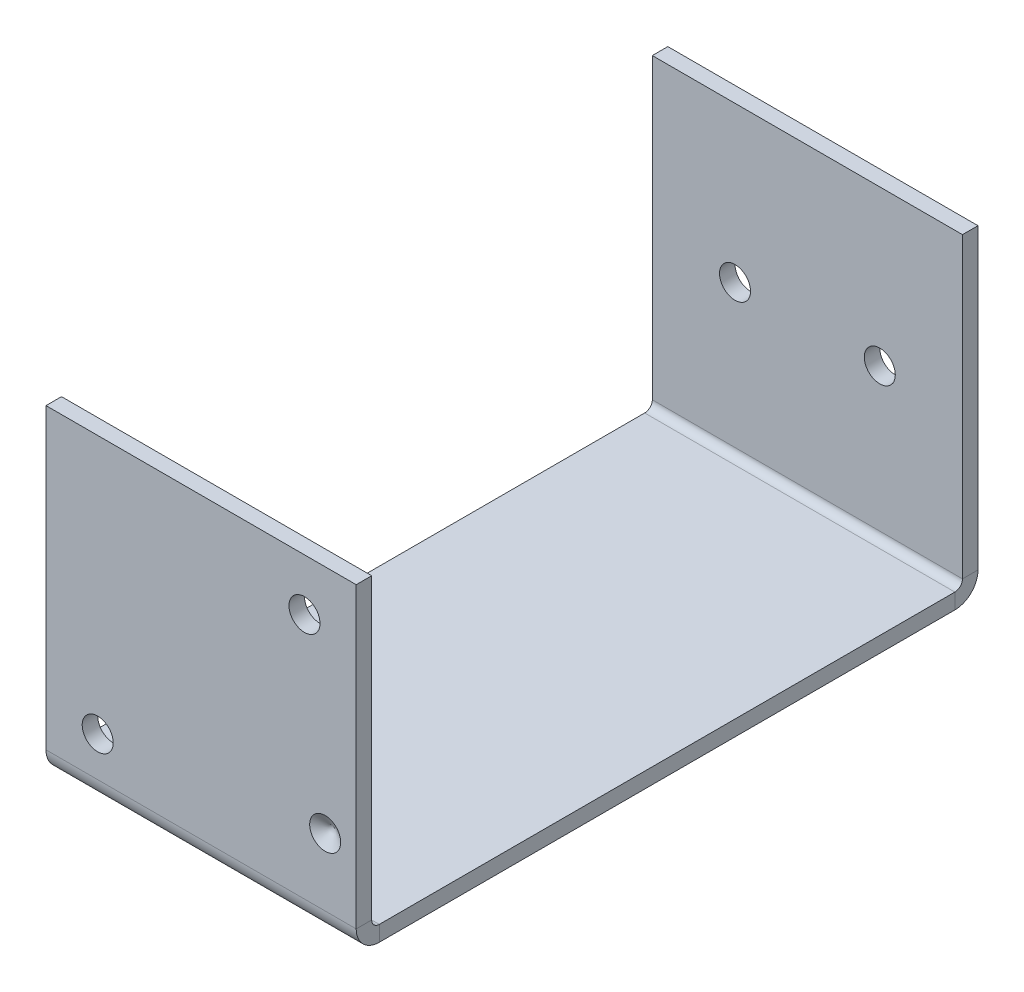
ISO-10303-21;
HEADER;
FILE_DESCRIPTION(('STEP AP214'),'2;1');
FILE_NAME('part.step','',(''),(''),'','','');
FILE_SCHEMA(('AUTOMOTIVE_DESIGN { 1 0 10303 214 1 1 1 1 }'));
ENDSEC;
DATA;
#1=APPLICATION_CONTEXT('core data for automotive mechanical design processes');
#2=APPLICATION_PROTOCOL_DEFINITION('international standard','automotive_design',2000,#1);
#3=PRODUCT_CONTEXT('',#1,'mechanical');
#4=PRODUCT('Part','Part','',(#3));
#5=PRODUCT_RELATED_PRODUCT_CATEGORY('part','',(#4));
#6=PRODUCT_DEFINITION_FORMATION('','',#4);
#7=PRODUCT_DEFINITION_CONTEXT('part definition',#1,'design');
#8=PRODUCT_DEFINITION('design','',#6,#7);
#9=PRODUCT_DEFINITION_SHAPE('','',#8);
#10=(LENGTH_UNIT() NAMED_UNIT(*) SI_UNIT(.MILLI.,.METRE.));
#11=(NAMED_UNIT(*) PLANE_ANGLE_UNIT() SI_UNIT($,.RADIAN.));
#12=(NAMED_UNIT(*) SI_UNIT($,.STERADIAN.) SOLID_ANGLE_UNIT());
#13=UNCERTAINTY_MEASURE_WITH_UNIT(LENGTH_MEASURE(1.E-05),#10,'distance_accuracy_value','');
#14=(GEOMETRIC_REPRESENTATION_CONTEXT(3) GLOBAL_UNCERTAINTY_ASSIGNED_CONTEXT((#13)) GLOBAL_UNIT_ASSIGNED_CONTEXT((#10,
#11,#12)) REPRESENTATION_CONTEXT('',''));
#15=CARTESIAN_POINT('',(0.,0.,0.));
#16=DIRECTION('',(0.,0.,1.));
#17=DIRECTION('',(1.,0.,0.));
#18=AXIS2_PLACEMENT_3D('',#15,#16,#17);
#19=CARTESIAN_POINT('',(0.,0.,0.));
#20=DIRECTION('',(0.,-1.,0.));
#21=DIRECTION('',(0.,0.,-1.));
#22=AXIS2_PLACEMENT_3D('',#19,#20,#21);
#23=PLANE('',#22);
#24=DIRECTION('',(0.,0.,1.));
#25=VECTOR('',#24,1.);
#26=CARTESIAN_POINT('',(0.,0.,0.));
#27=LINE('',#26,#25);
#28=CARTESIAN_POINT('',(0.,0.,-86.8324270902934));
#29=VERTEX_POINT('',#28);
#30=CARTESIAN_POINT('',(0.,0.,-31.1675729097066));
#31=VERTEX_POINT('',#30);
#32=EDGE_CURVE('E75',#29,#31,#27,.T.);
#33=ORIENTED_EDGE('',*,*,#32,.T.);
#34=DIRECTION('',(1.,0.,0.));
#35=VECTOR('',#34,1.);
#36=CARTESIAN_POINT('',(0.,0.,-31.1675729097066));
#37=LINE('',#36,#35);
#38=CARTESIAN_POINT('',(30.,0.,-31.1675729097066));
#39=VERTEX_POINT('',#38);
#40=EDGE_CURVE('E67',#31,#39,#37,.T.);
#41=ORIENTED_EDGE('',*,*,#40,.T.);
#42=DIRECTION('',(0.,0.,-1.));
#43=VECTOR('',#42,1.);
#44=CARTESIAN_POINT('',(30.,0.,0.));
#45=LINE('',#44,#43);
#46=CARTESIAN_POINT('',(30.,0.,-86.8324270902933));
#47=VERTEX_POINT('',#46);
#48=EDGE_CURVE('E83',#39,#47,#45,.T.);
#49=ORIENTED_EDGE('',*,*,#48,.T.);
#50=DIRECTION('',(1.,0.,0.));
#51=VECTOR('',#50,1.);
#52=CARTESIAN_POINT('',(0.,0.,-86.8324270902934));
#53=LINE('',#52,#51);
#54=EDGE_CURVE('E279',#29,#47,#53,.T.);
#55=ORIENTED_EDGE('',*,*,#54,.F.);
#56=EDGE_LOOP('',(#33,#41,#49,#55));
#57=FACE_BOUND('',#56,.T.);
#58=ADVANCED_FACE('F58',(#57),#23,.F.);
#59=CARTESIAN_POINT('',(0.,-1.5,0.));
#60=DIRECTION('',(-1.,0.,0.));
#61=DIRECTION('',(0.,0.,1.));
#62=AXIS2_PLACEMENT_3D('',#59,#60,#61);
#63=PLANE('',#62);
#64=DIRECTION('',(0.,-1.,0.));
#65=VECTOR('',#64,1.);
#66=CARTESIAN_POINT('',(0.,-1.5,-31.1675729097066));
#67=LINE('',#66,#65);
#68=CARTESIAN_POINT('',(0.,-1.5,-31.1675729097066));
#69=VERTEX_POINT('',#68);
#70=EDGE_CURVE('E14',#31,#69,#67,.T.);
#71=ORIENTED_EDGE('',*,*,#70,.F.);
#72=ORIENTED_EDGE('',*,*,#32,.F.);
#73=DIRECTION('',(0.,-1.,0.));
#74=VECTOR('',#73,1.);
#75=CARTESIAN_POINT('',(0.,-1.50000000000001,-86.8324270902934));
#76=LINE('',#75,#74);
#77=CARTESIAN_POINT('',(0.,-1.5,-86.8324270902933));
#78=VERTEX_POINT('',#77);
#79=EDGE_CURVE('E276',#29,#78,#76,.T.);
#80=ORIENTED_EDGE('',*,*,#79,.T.);
#81=DIRECTION('',(0.,0.,1.));
#82=VECTOR('',#81,1.);
#83=CARTESIAN_POINT('',(0.,-1.5,0.));
#84=LINE('',#83,#82);
#85=EDGE_CURVE('E291',#78,#69,#84,.T.);
#86=ORIENTED_EDGE('',*,*,#85,.T.);
#87=EDGE_LOOP('',(#71,#72,#80,#86));
#88=FACE_BOUND('',#87,.T.);
#89=ADVANCED_FACE('F60',(#88),#63,.T.);
#90=CARTESIAN_POINT('',(30.,-1.5,0.));
#91=DIRECTION('',(1.,0.,0.));
#92=DIRECTION('',(0.,0.,-1.));
#93=AXIS2_PLACEMENT_3D('',#90,#91,#92);
#94=PLANE('',#93);
#95=DIRECTION('',(0.,1.,0.));
#96=VECTOR('',#95,1.);
#97=CARTESIAN_POINT('',(30.,-1.5,-31.1675729097066));
#98=LINE('',#97,#96);
#99=CARTESIAN_POINT('',(30.,-1.5,-31.1675729097066));
#100=VERTEX_POINT('',#99);
#101=EDGE_CURVE('E287',#100,#39,#98,.T.);
#102=ORIENTED_EDGE('',*,*,#101,.F.);
#103=DIRECTION('',(0.,0.,-1.));
#104=VECTOR('',#103,1.);
#105=CARTESIAN_POINT('',(30.,-1.5,0.));
#106=LINE('',#105,#104);
#107=CARTESIAN_POINT('',(30.,-1.5,-86.8324270902933));
#108=VERTEX_POINT('',#107);
#109=EDGE_CURVE('E62',#100,#108,#106,.T.);
#110=ORIENTED_EDGE('',*,*,#109,.T.);
#111=DIRECTION('',(0.,1.,0.));
#112=VECTOR('',#111,1.);
#113=CARTESIAN_POINT('',(30.,-1.50000000000001,-86.8324270902934));
#114=LINE('',#113,#112);
#115=EDGE_CURVE('E282',#108,#47,#114,.T.);
#116=ORIENTED_EDGE('',*,*,#115,.T.);
#117=ORIENTED_EDGE('',*,*,#48,.F.);
#118=EDGE_LOOP('',(#102,#110,#116,#117));
#119=FACE_BOUND('',#118,.T.);
#120=ADVANCED_FACE('F295',(#119),#94,.T.);
#121=CARTESIAN_POINT('',(0.,-1.5,0.));
#122=DIRECTION('',(0.,-1.,0.));
#123=DIRECTION('',(0.,0.,-1.));
#124=AXIS2_PLACEMENT_3D('',#121,#122,#123);
#125=PLANE('',#124);
#126=DIRECTION('',(1.,0.,0.));
#127=VECTOR('',#126,1.);
#128=CARTESIAN_POINT('',(0.,-1.5,-31.1675729097066));
#129=LINE('',#128,#127);
#130=EDGE_CURVE('E284',#69,#100,#129,.T.);
#131=ORIENTED_EDGE('',*,*,#130,.F.);
#132=ORIENTED_EDGE('',*,*,#85,.F.);
#133=DIRECTION('',(1.,0.,0.));
#134=VECTOR('',#133,1.);
#135=CARTESIAN_POINT('',(0.,-1.5,-86.8324270902934));
#136=LINE('',#135,#134);
#137=EDGE_CURVE('E273',#78,#108,#136,.T.);
#138=ORIENTED_EDGE('',*,*,#137,.T.);
#139=ORIENTED_EDGE('',*,*,#109,.F.);
#140=EDGE_LOOP('',(#131,#132,#138,#139));
#141=FACE_BOUND('',#140,.T.);
#142=ADVANCED_FACE('F372',(#141),#125,.T.);
#143=CARTESIAN_POINT('',(0.,0.7366,-86.8324270902934));
#144=DIRECTION('',(-1.,0.,0.));
#145=DIRECTION('',(0.,0.,1.));
#146=AXIS2_PLACEMENT_3D('',#143,#144,#145);
#147=PLANE('',#146);
#148=ORIENTED_EDGE('',*,*,#79,.F.);
#149=CARTESIAN_POINT('',(0.,0.7366,-86.8324270902934));
#150=DIRECTION('',(1.,0.,0.));
#151=DIRECTION('',(0.,0.,-1.));
#152=AXIS2_PLACEMENT_3D('',#149,#150,#151);
#153=CIRCLE('',#152,0.7366);
#154=CARTESIAN_POINT('',(0.,0.736600000000004,-87.5690270902933));
#155=VERTEX_POINT('',#154);
#156=EDGE_CURVE('E222',#29,#155,#153,.T.);
#157=ORIENTED_EDGE('',*,*,#156,.T.);
#158=DIRECTION('',(0.,0.,-1.));
#159=VECTOR('',#158,1.);
#160=CARTESIAN_POINT('',(0.,0.736600000000032,-89.0690270902933));
#161=LINE('',#160,#159);
#162=CARTESIAN_POINT('',(0.,0.736600000000004,-89.0690270902933));
#163=VERTEX_POINT('',#162);
#164=EDGE_CURVE('E255',#155,#163,#161,.T.);
#165=ORIENTED_EDGE('',*,*,#164,.T.);
#166=CARTESIAN_POINT('',(0.,0.7366,-86.8324270902934));
#167=DIRECTION('',(1.,0.,0.));
#168=DIRECTION('',(0.,0.,1.));
#169=AXIS2_PLACEMENT_3D('',#166,#167,#168);
#170=CIRCLE('',#169,2.2366);
#171=EDGE_CURVE('E263',#78,#163,#170,.T.);
#172=ORIENTED_EDGE('',*,*,#171,.F.);
#173=EDGE_LOOP('',(#148,#157,#165,#172));
#174=FACE_BOUND('',#173,.T.);
#175=ADVANCED_FACE('F315',(#174),#147,.T.);
#176=CARTESIAN_POINT('',(30.,0.7366,-86.8324270902934));
#177=DIRECTION('',(1.,0.,0.));
#178=DIRECTION('',(0.,0.,-1.));
#179=AXIS2_PLACEMENT_3D('',#176,#177,#178);
#180=PLANE('',#179);
#181=CARTESIAN_POINT('',(30.,0.7366,-86.8324270902934));
#182=DIRECTION('',(1.,0.,0.));
#183=DIRECTION('',(0.,0.,-1.));
#184=AXIS2_PLACEMENT_3D('',#181,#182,#183);
#185=CIRCLE('',#184,0.7366);
#186=CARTESIAN_POINT('',(30.,0.736600000000004,-87.5690270902933));
#187=VERTEX_POINT('',#186);
#188=EDGE_CURVE('E267',#187,#47,#185,.F.);
#189=ORIENTED_EDGE('',*,*,#188,.T.);
#190=ORIENTED_EDGE('',*,*,#115,.F.);
#191=CARTESIAN_POINT('',(30.,0.7366,-86.8324270902934));
#192=DIRECTION('',(-1.,0.,0.));
#193=DIRECTION('',(0.,0.,-1.));
#194=AXIS2_PLACEMENT_3D('',#191,#192,#193);
#195=CIRCLE('',#194,2.2366);
#196=CARTESIAN_POINT('',(30.,0.736600000000007,-89.0690270902934));
#197=VERTEX_POINT('',#196);
#198=EDGE_CURVE('E266',#197,#108,#195,.T.);
#199=ORIENTED_EDGE('',*,*,#198,.F.);
#200=DIRECTION('',(0.,0.,1.));
#201=VECTOR('',#200,1.);
#202=CARTESIAN_POINT('',(30.,0.736600000000032,-89.0690270902933));
#203=LINE('',#202,#201);
#204=EDGE_CURVE('E258',#197,#187,#203,.T.);
#205=ORIENTED_EDGE('',*,*,#204,.T.);
#206=EDGE_LOOP('',(#189,#190,#199,#205));
#207=FACE_BOUND('',#206,.T.);
#208=ADVANCED_FACE('F298',(#207),#180,.T.);
#209=CARTESIAN_POINT('',(-15.1281082379549,0.7366,-86.8324270902934));
#210=DIRECTION('',(1.,0.,0.));
#211=DIRECTION('',(0.,0.,-1.));
#212=AXIS2_PLACEMENT_3D('',#209,#210,#211);
#213=CYLINDRICAL_SURFACE('',#212,2.2366);
#214=DIRECTION('',(1.,0.,0.));
#215=VECTOR('',#214,1.);
#216=CARTESIAN_POINT('',(0.,0.736600000000032,-89.0690270902933));
#217=LINE('',#216,#215);
#218=EDGE_CURVE('E214',#163,#197,#217,.T.);
#219=ORIENTED_EDGE('',*,*,#218,.T.);
#220=ORIENTED_EDGE('',*,*,#198,.T.);
#221=ORIENTED_EDGE('',*,*,#137,.F.);
#222=ORIENTED_EDGE('',*,*,#171,.T.);
#223=EDGE_LOOP('',(#219,#220,#221,#222));
#224=FACE_BOUND('',#223,.T.);
#225=ADVANCED_FACE('F301',(#224),#213,.T.);
#226=CARTESIAN_POINT('',(-15.1281082379549,0.7366,-86.8324270902934));
#227=DIRECTION('',(1.,0.,0.));
#228=DIRECTION('',(0.,0.,-1.));
#229=AXIS2_PLACEMENT_3D('',#226,#227,#228);
#230=CYLINDRICAL_SURFACE('',#229,0.7366);
#231=DIRECTION('',(1.,0.,0.));
#232=VECTOR('',#231,1.);
#233=CARTESIAN_POINT('',(0.,0.736600000000032,-87.5690270902933));
#234=LINE('',#233,#232);
#235=EDGE_CURVE('E230',#155,#187,#234,.T.);
#236=ORIENTED_EDGE('',*,*,#235,.F.);
#237=ORIENTED_EDGE('',*,*,#156,.F.);
#238=ORIENTED_EDGE('',*,*,#54,.T.);
#239=ORIENTED_EDGE('',*,*,#188,.F.);
#240=EDGE_LOOP('',(#236,#237,#238,#239));
#241=FACE_BOUND('',#240,.T.);
#242=ADVANCED_FACE('F319',(#241),#230,.F.);
#243=CARTESIAN_POINT('',(8.,14.5690270902934,-89.0690270902933));
#244=DIRECTION('',(0.,0.,1.));
#245=DIRECTION('',(0.,-1.,0.));
#246=AXIS2_PLACEMENT_3D('',#243,#244,#245);
#247=CYLINDRICAL_SURFACE('',#246,1.5);
#248=CARTESIAN_POINT('',(8.,14.5690270902934,-89.0690270902933));
#249=DIRECTION('',(0.,0.,1.));
#250=DIRECTION('',(0.,-1.,0.));
#251=AXIS2_PLACEMENT_3D('',#248,#249,#250);
#252=CIRCLE('',#251,1.5);
#253=CARTESIAN_POINT('',(8.,13.0690270902934,-89.0690270902933));
#254=VERTEX_POINT('',#253);
#255=EDGE_CURVE('E238',#254,#254,#252,.T.);
#256=ORIENTED_EDGE('',*,*,#255,.F.);
#257=EDGE_LOOP('',(#256));
#258=FACE_BOUND('',#257,.T.);
#259=CARTESIAN_POINT('',(8.,14.5690270902934,-87.5690270902933));
#260=DIRECTION('',(0.,0.,1.));
#261=DIRECTION('',(0.,-1.,0.));
#262=AXIS2_PLACEMENT_3D('',#259,#260,#261);
#263=CIRCLE('',#262,1.5);
#264=CARTESIAN_POINT('',(8.,13.0690270902934,-87.5690270902933));
#265=VERTEX_POINT('',#264);
#266=EDGE_CURVE('E252',#265,#265,#263,.T.);
#267=ORIENTED_EDGE('',*,*,#266,.T.);
#268=EDGE_LOOP('',(#267));
#269=FACE_BOUND('',#268,.T.);
#270=ADVANCED_FACE('F382',(#258,#269),#247,.F.);
#271=CARTESIAN_POINT('',(22.,14.5690270902934,-89.0690270902933));
#272=DIRECTION('',(0.,0.,1.));
#273=DIRECTION('',(0.,-1.,0.));
#274=AXIS2_PLACEMENT_3D('',#271,#272,#273);
#275=CYLINDRICAL_SURFACE('',#274,1.5);
#276=CARTESIAN_POINT('',(22.,14.5690270902934,-89.0690270902933));
#277=DIRECTION('',(0.,0.,1.));
#278=DIRECTION('',(0.,-1.,0.));
#279=AXIS2_PLACEMENT_3D('',#276,#277,#278);
#280=CIRCLE('',#279,1.5);
#281=CARTESIAN_POINT('',(22.,13.0690270902934,-89.0690270902933));
#282=VERTEX_POINT('',#281);
#283=EDGE_CURVE('E241',#282,#282,#280,.T.);
#284=ORIENTED_EDGE('',*,*,#283,.F.);
#285=EDGE_LOOP('',(#284));
#286=FACE_BOUND('',#285,.T.);
#287=CARTESIAN_POINT('',(22.,14.5690270902934,-87.5690270902933));
#288=DIRECTION('',(0.,0.,1.));
#289=DIRECTION('',(0.,-1.,0.));
#290=AXIS2_PLACEMENT_3D('',#287,#288,#289);
#291=CIRCLE('',#290,1.5);
#292=CARTESIAN_POINT('',(22.,13.0690270902934,-87.5690270902933));
#293=VERTEX_POINT('',#292);
#294=EDGE_CURVE('E249',#293,#293,#291,.T.);
#295=ORIENTED_EDGE('',*,*,#294,.T.);
#296=EDGE_LOOP('',(#295));
#297=FACE_BOUND('',#296,.T.);
#298=ADVANCED_FACE('F400',(#286,#297),#275,.F.);
#299=CARTESIAN_POINT('',(0.,29.5690270902934,-89.0690270902932));
#300=DIRECTION('',(0.,1.,0.));
#301=DIRECTION('',(-1.,0.,0.));
#302=AXIS2_PLACEMENT_3D('',#299,#300,#301);
#303=PLANE('',#302);
#304=DIRECTION('',(-1.,0.,0.));
#305=VECTOR('',#304,1.);
#306=CARTESIAN_POINT('',(0.,29.5690270902934,-87.5690270902932));
#307=LINE('',#306,#305);
#308=CARTESIAN_POINT('',(30.,29.5690270902934,-87.5690270902932));
#309=VERTEX_POINT('',#308);
#310=CARTESIAN_POINT('',(0.,29.5690270902934,-87.5690270902932));
#311=VERTEX_POINT('',#310);
#312=EDGE_CURVE('E225',#309,#311,#307,.T.);
#313=ORIENTED_EDGE('',*,*,#312,.F.);
#314=DIRECTION('',(0.,0.,1.));
#315=VECTOR('',#314,1.);
#316=CARTESIAN_POINT('',(30.,29.5690270902934,-89.0690270902932));
#317=LINE('',#316,#315);
#318=CARTESIAN_POINT('',(30.,29.5690270902934,-89.0690270902932));
#319=VERTEX_POINT('',#318);
#320=EDGE_CURVE('E219',#319,#309,#317,.T.);
#321=ORIENTED_EDGE('',*,*,#320,.F.);
#322=DIRECTION('',(-1.,0.,0.));
#323=VECTOR('',#322,1.);
#324=CARTESIAN_POINT('',(0.,29.5690270902934,-89.0690270902932));
#325=LINE('',#324,#323);
#326=CARTESIAN_POINT('',(0.,29.5690270902934,-89.0690270902932));
#327=VERTEX_POINT('',#326);
#328=EDGE_CURVE('E246',#319,#327,#325,.T.);
#329=ORIENTED_EDGE('',*,*,#328,.T.);
#330=DIRECTION('',(0.,0.,1.));
#331=VECTOR('',#330,1.);
#332=CARTESIAN_POINT('',(0.,29.5690270902934,-89.0690270902932));
#333=LINE('',#332,#331);
#334=EDGE_CURVE('E244',#327,#311,#333,.T.);
#335=ORIENTED_EDGE('',*,*,#334,.T.);
#336=EDGE_LOOP('',(#313,#321,#329,#335));
#337=FACE_BOUND('',#336,.T.);
#338=ADVANCED_FACE('F397',(#337),#303,.T.);
#339=CARTESIAN_POINT('',(0.,-88.4309729097066,-89.0690270902937));
#340=DIRECTION('',(0.,0.,-1.));
#341=DIRECTION('',(0.,1.,0.));
#342=AXIS2_PLACEMENT_3D('',#339,#340,#341);
#343=PLANE('',#342);
#344=ORIENTED_EDGE('',*,*,#218,.F.);
#345=DIRECTION('',(0.,-1.,0.));
#346=VECTOR('',#345,1.);
#347=CARTESIAN_POINT('',(0.,-88.4309729097066,-89.0690270902937));
#348=LINE('',#347,#346);
#349=EDGE_CURVE('E235',#327,#163,#348,.T.);
#350=ORIENTED_EDGE('',*,*,#349,.F.);
#351=ORIENTED_EDGE('',*,*,#328,.F.);
#352=DIRECTION('',(0.,1.,0.));
#353=VECTOR('',#352,1.);
#354=CARTESIAN_POINT('',(30.,-88.4309729097066,-89.0690270902937));
#355=LINE('',#354,#353);
#356=EDGE_CURVE('E223',#197,#319,#355,.T.);
#357=ORIENTED_EDGE('',*,*,#356,.F.);
#358=EDGE_LOOP('',(#344,#350,#351,#357));
#359=FACE_BOUND('',#358,.T.);
#360=ORIENTED_EDGE('',*,*,#283,.T.);
#361=EDGE_LOOP('',(#360));
#362=FACE_BOUND('',#361,.T.);
#363=ORIENTED_EDGE('',*,*,#255,.T.);
#364=EDGE_LOOP('',(#363));
#365=FACE_BOUND('',#364,.T.);
#366=ADVANCED_FACE('F306',(#359,#362,#365),#343,.T.);
#367=CARTESIAN_POINT('',(0.,-88.4309729097066,-89.0690270902937));
#368=DIRECTION('',(-1.,0.,0.));
#369=DIRECTION('',(0.,-1.,0.));
#370=AXIS2_PLACEMENT_3D('',#367,#368,#369);
#371=PLANE('',#370);
#372=ORIENTED_EDGE('',*,*,#164,.F.);
#373=DIRECTION('',(0.,-1.,0.));
#374=VECTOR('',#373,1.);
#375=CARTESIAN_POINT('',(0.,-88.4309729097066,-87.5690270902937));
#376=LINE('',#375,#374);
#377=EDGE_CURVE('E233',#311,#155,#376,.T.);
#378=ORIENTED_EDGE('',*,*,#377,.F.);
#379=ORIENTED_EDGE('',*,*,#334,.F.);
#380=ORIENTED_EDGE('',*,*,#349,.T.);
#381=EDGE_LOOP('',(#372,#378,#379,#380));
#382=FACE_BOUND('',#381,.T.);
#383=ADVANCED_FACE('F311',(#382),#371,.T.);
#384=CARTESIAN_POINT('',(0.,-88.4309729097066,-87.5690270902937));
#385=DIRECTION('',(0.,0.,-1.));
#386=DIRECTION('',(0.,1.,0.));
#387=AXIS2_PLACEMENT_3D('',#384,#385,#386);
#388=PLANE('',#387);
#389=ORIENTED_EDGE('',*,*,#266,.F.);
#390=EDGE_LOOP('',(#389));
#391=FACE_BOUND('',#390,.T.);
#392=ORIENTED_EDGE('',*,*,#294,.F.);
#393=EDGE_LOOP('',(#392));
#394=FACE_BOUND('',#393,.T.);
#395=ORIENTED_EDGE('',*,*,#377,.T.);
#396=ORIENTED_EDGE('',*,*,#235,.T.);
#397=DIRECTION('',(0.,1.,0.));
#398=VECTOR('',#397,1.);
#399=CARTESIAN_POINT('',(30.,-88.4309729097066,-87.5690270902937));
#400=LINE('',#399,#398);
#401=EDGE_CURVE('E228',#187,#309,#400,.T.);
#402=ORIENTED_EDGE('',*,*,#401,.T.);
#403=ORIENTED_EDGE('',*,*,#312,.T.);
#404=EDGE_LOOP('',(#395,#396,#402,#403));
#405=FACE_BOUND('',#404,.T.);
#406=ADVANCED_FACE('F388',(#391,#394,#405),#388,.F.);
#407=CARTESIAN_POINT('',(30.,-88.4309729097066,-89.0690270902937));
#408=DIRECTION('',(1.,0.,0.));
#409=DIRECTION('',(0.,1.,0.));
#410=AXIS2_PLACEMENT_3D('',#407,#408,#409);
#411=PLANE('',#410);
#412=ORIENTED_EDGE('',*,*,#204,.F.);
#413=ORIENTED_EDGE('',*,*,#356,.T.);
#414=ORIENTED_EDGE('',*,*,#320,.T.);
#415=ORIENTED_EDGE('',*,*,#401,.F.);
#416=EDGE_LOOP('',(#412,#413,#414,#415));
#417=FACE_BOUND('',#416,.T.);
#418=ADVANCED_FACE('F385',(#417),#411,.T.);
#419=CARTESIAN_POINT('',(0.,0.7366,-31.1675729097066));
#420=DIRECTION('',(-1.,0.,0.));
#421=DIRECTION('',(0.,0.,1.));
#422=AXIS2_PLACEMENT_3D('',#419,#420,#421);
#423=PLANE('',#422);
#424=DIRECTION('',(0.,0.,1.));
#425=VECTOR('',#424,1.);
#426=CARTESIAN_POINT('',(0.,0.7366,-28.9309729097066));
#427=LINE('',#426,#425);
#428=CARTESIAN_POINT('',(0.,0.7366,-30.4309729097066));
#429=VERTEX_POINT('',#428);
#430=CARTESIAN_POINT('',(0.,0.736600000000007,-28.9309729097067));
#431=VERTEX_POINT('',#430);
#432=EDGE_CURVE('E174',#429,#431,#427,.T.);
#433=ORIENTED_EDGE('',*,*,#432,.F.);
#434=CARTESIAN_POINT('',(0.,0.7366,-31.1675729097066));
#435=DIRECTION('',(-1.,0.,0.));
#436=DIRECTION('',(0.,0.,1.));
#437=AXIS2_PLACEMENT_3D('',#434,#435,#436);
#438=CIRCLE('',#437,0.7366);
#439=EDGE_CURVE('E171',#429,#31,#438,.F.);
#440=ORIENTED_EDGE('',*,*,#439,.T.);
#441=ORIENTED_EDGE('',*,*,#70,.T.);
#442=CARTESIAN_POINT('',(0.,0.7366,-31.1675729097066));
#443=DIRECTION('',(1.,0.,0.));
#444=DIRECTION('',(0.,0.,1.));
#445=AXIS2_PLACEMENT_3D('',#442,#443,#444);
#446=CIRCLE('',#445,2.2366);
#447=EDGE_CURVE('E207',#431,#69,#446,.T.);
#448=ORIENTED_EDGE('',*,*,#447,.F.);
#449=EDGE_LOOP('',(#433,#440,#441,#448));
#450=FACE_BOUND('',#449,.T.);
#451=ADVANCED_FACE('F329',(#450),#423,.T.);
#452=CARTESIAN_POINT('',(30.,0.7366,-31.1675729097066));
#453=DIRECTION('',(1.,0.,0.));
#454=DIRECTION('',(0.,0.,-1.));
#455=AXIS2_PLACEMENT_3D('',#452,#453,#454);
#456=PLANE('',#455);
#457=CARTESIAN_POINT('',(30.,0.7366,-31.1675729097066));
#458=DIRECTION('',(-1.,0.,0.));
#459=DIRECTION('',(0.,0.,1.));
#460=AXIS2_PLACEMENT_3D('',#457,#458,#459);
#461=CIRCLE('',#460,0.7366);
#462=CARTESIAN_POINT('',(30.,0.7366,-30.4309729097066));
#463=VERTEX_POINT('',#462);
#464=EDGE_CURVE('E211',#39,#463,#461,.T.);
#465=ORIENTED_EDGE('',*,*,#464,.T.);
#466=DIRECTION('',(0.,0.,-1.));
#467=VECTOR('',#466,1.);
#468=CARTESIAN_POINT('',(30.,0.7366,-28.9309729097066));
#469=LINE('',#468,#467);
#470=CARTESIAN_POINT('',(30.,0.736600000000007,-28.9309729097066));
#471=VERTEX_POINT('',#470);
#472=EDGE_CURVE('E183',#471,#463,#469,.T.);
#473=ORIENTED_EDGE('',*,*,#472,.F.);
#474=CARTESIAN_POINT('',(30.,0.7366,-31.1675729097066));
#475=DIRECTION('',(-1.,0.,0.));
#476=DIRECTION('',(0.,0.,-1.));
#477=AXIS2_PLACEMENT_3D('',#474,#475,#476);
#478=CIRCLE('',#477,2.2366);
#479=EDGE_CURVE('E210',#100,#471,#478,.T.);
#480=ORIENTED_EDGE('',*,*,#479,.F.);
#481=ORIENTED_EDGE('',*,*,#101,.T.);
#482=EDGE_LOOP('',(#465,#473,#480,#481));
#483=FACE_BOUND('',#482,.T.);
#484=ADVANCED_FACE('F344',(#483),#456,.T.);
#485=CARTESIAN_POINT('',(45.1281082379549,0.7366,-31.1675729097066));
#486=DIRECTION('',(-1.,0.,0.));
#487=DIRECTION('',(0.,0.,1.));
#488=AXIS2_PLACEMENT_3D('',#485,#486,#487);
#489=CYLINDRICAL_SURFACE('',#488,2.2366);
#490=ORIENTED_EDGE('',*,*,#130,.T.);
#491=ORIENTED_EDGE('',*,*,#479,.T.);
#492=DIRECTION('',(1.,0.,0.));
#493=VECTOR('',#492,1.);
#494=CARTESIAN_POINT('',(0.,0.7366,-28.9309729097066));
#495=LINE('',#494,#493);
#496=EDGE_CURVE('E189',#431,#471,#495,.T.);
#497=ORIENTED_EDGE('',*,*,#496,.F.);
#498=ORIENTED_EDGE('',*,*,#447,.T.);
#499=EDGE_LOOP('',(#490,#491,#497,#498));
#500=FACE_BOUND('',#499,.T.);
#501=ADVANCED_FACE('F340',(#500),#489,.T.);
#502=CARTESIAN_POINT('',(45.1281082379549,0.7366,-31.1675729097066));
#503=DIRECTION('',(-1.,0.,0.));
#504=DIRECTION('',(0.,0.,1.));
#505=AXIS2_PLACEMENT_3D('',#502,#503,#504);
#506=CYLINDRICAL_SURFACE('',#505,0.7366);
#507=ORIENTED_EDGE('',*,*,#40,.F.);
#508=ORIENTED_EDGE('',*,*,#439,.F.);
#509=DIRECTION('',(1.,0.,0.));
#510=VECTOR('',#509,1.);
#511=CARTESIAN_POINT('',(0.,0.736599999999993,-30.4309729097066));
#512=LINE('',#511,#510);
#513=EDGE_CURVE('E162',#429,#463,#512,.T.);
#514=ORIENTED_EDGE('',*,*,#513,.T.);
#515=ORIENTED_EDGE('',*,*,#464,.F.);
#516=EDGE_LOOP('',(#507,#508,#514,#515));
#517=FACE_BOUND('',#516,.T.);
#518=ADVANCED_FACE('F327',(#517),#506,.F.);
#519=CARTESIAN_POINT('',(0.,29.5690270902933,-28.9309729097067));
#520=DIRECTION('',(0.,1.,0.));
#521=DIRECTION('',(1.,0.,0.));
#522=AXIS2_PLACEMENT_3D('',#519,#520,#521);
#523=PLANE('',#522);
#524=DIRECTION('',(1.,0.,0.));
#525=VECTOR('',#524,1.);
#526=CARTESIAN_POINT('',(0.,29.5690270902933,-30.4309729097067));
#527=LINE('',#526,#525);
#528=CARTESIAN_POINT('',(0.,29.5690270902933,-30.4309729097067));
#529=VERTEX_POINT('',#528);
#530=CARTESIAN_POINT('',(30.,29.5690270902933,-30.4309729097067));
#531=VERTEX_POINT('',#530);
#532=EDGE_CURVE('E178',#529,#531,#527,.T.);
#533=ORIENTED_EDGE('',*,*,#532,.F.);
#534=DIRECTION('',(0.,0.,-1.));
#535=VECTOR('',#534,1.);
#536=CARTESIAN_POINT('',(0.,29.5690270902933,-28.9309729097067));
#537=LINE('',#536,#535);
#538=CARTESIAN_POINT('',(0.,29.5690270902933,-28.9309729097067));
#539=VERTEX_POINT('',#538);
#540=EDGE_CURVE('E168',#539,#529,#537,.T.);
#541=ORIENTED_EDGE('',*,*,#540,.F.);
#542=DIRECTION('',(1.,0.,0.));
#543=VECTOR('',#542,1.);
#544=CARTESIAN_POINT('',(0.,29.5690270902933,-28.9309729097067));
#545=LINE('',#544,#543);
#546=CARTESIAN_POINT('',(30.,29.5690270902933,-28.9309729097067));
#547=VERTEX_POINT('',#546);
#548=EDGE_CURVE('E165',#539,#547,#545,.T.);
#549=ORIENTED_EDGE('',*,*,#548,.T.);
#550=DIRECTION('',(0.,0.,-1.));
#551=VECTOR('',#550,1.);
#552=CARTESIAN_POINT('',(30.,29.5690270902933,-28.9309729097067));
#553=LINE('',#552,#551);
#554=EDGE_CURVE('E203',#547,#531,#553,.T.);
#555=ORIENTED_EDGE('',*,*,#554,.T.);
#556=EDGE_LOOP('',(#533,#541,#549,#555));
#557=FACE_BOUND('',#556,.T.);
#558=ADVANCED_FACE('F353',(#557),#523,.T.);
#559=CARTESIAN_POINT('',(5.,4.56902709029335,-28.9309729097067));
#560=DIRECTION('',(0.,0.,-1.));
#561=DIRECTION('',(0.,1.,0.));
#562=AXIS2_PLACEMENT_3D('',#559,#560,#561);
#563=CYLINDRICAL_SURFACE('',#562,1.5);
#564=CARTESIAN_POINT('',(5.,4.56902709029335,-28.9309729097067));
#565=DIRECTION('',(0.,0.,-1.));
#566=DIRECTION('',(0.,1.,0.));
#567=AXIS2_PLACEMENT_3D('',#564,#565,#566);
#568=CIRCLE('',#567,1.5);
#569=CARTESIAN_POINT('',(5.,6.06902709029335,-28.9309729097067));
#570=VERTEX_POINT('',#569);
#571=EDGE_CURVE('E191',#570,#570,#568,.T.);
#572=ORIENTED_EDGE('',*,*,#571,.F.);
#573=EDGE_LOOP('',(#572));
#574=FACE_BOUND('',#573,.T.);
#575=CARTESIAN_POINT('',(5.,4.56902709029334,-30.4309729097067));
#576=DIRECTION('',(0.,0.,-1.));
#577=DIRECTION('',(0.,1.,0.));
#578=AXIS2_PLACEMENT_3D('',#575,#576,#577);
#579=CIRCLE('',#578,1.5);
#580=CARTESIAN_POINT('',(5.,6.06902709029334,-30.4309729097067));
#581=VERTEX_POINT('',#580);
#582=EDGE_CURVE('E200',#581,#581,#579,.T.);
#583=ORIENTED_EDGE('',*,*,#582,.T.);
#584=EDGE_LOOP('',(#583));
#585=FACE_BOUND('',#584,.T.);
#586=ADVANCED_FACE('F355',(#574,#585),#563,.F.);
#587=CARTESIAN_POINT('',(25.,24.5690270902933,-28.9309729097067));
#588=DIRECTION('',(0.,0.,-1.));
#589=DIRECTION('',(0.,1.,0.));
#590=AXIS2_PLACEMENT_3D('',#587,#588,#589);
#591=CYLINDRICAL_SURFACE('',#590,1.5);
#592=CARTESIAN_POINT('',(25.,24.5690270902933,-28.9309729097067));
#593=DIRECTION('',(0.,0.,-1.));
#594=DIRECTION('',(0.,1.,0.));
#595=AXIS2_PLACEMENT_3D('',#592,#593,#594);
#596=CIRCLE('',#595,1.5);
#597=CARTESIAN_POINT('',(25.,26.0690270902933,-28.9309729097067));
#598=VERTEX_POINT('',#597);
#599=EDGE_CURVE('E194',#598,#598,#596,.T.);
#600=ORIENTED_EDGE('',*,*,#599,.F.);
#601=EDGE_LOOP('',(#600));
#602=FACE_BOUND('',#601,.T.);
#603=CARTESIAN_POINT('',(25.,24.5690270902933,-30.4309729097067));
#604=DIRECTION('',(0.,0.,-1.));
#605=DIRECTION('',(0.,1.,0.));
#606=AXIS2_PLACEMENT_3D('',#603,#604,#605);
#607=CIRCLE('',#606,1.5);
#608=CARTESIAN_POINT('',(25.,26.0690270902933,-30.4309729097067));
#609=VERTEX_POINT('',#608);
#610=EDGE_CURVE('E197',#609,#609,#607,.T.);
#611=ORIENTED_EDGE('',*,*,#610,.T.);
#612=EDGE_LOOP('',(#611));
#613=FACE_BOUND('',#612,.T.);
#614=ADVANCED_FACE('F361',(#602,#613),#591,.F.);
#615=CARTESIAN_POINT('',(0.,29.5690270902933,-28.9309729097067));
#616=DIRECTION('',(0.,0.,1.));
#617=DIRECTION('',(0.,-1.,0.));
#618=AXIS2_PLACEMENT_3D('',#615,#616,#617);
#619=PLANE('',#618);
#620=CARTESIAN_POINT('',(27.0000000000606,7.23770773313032,-28.9309729097066));
#621=DIRECTION('',(0.,0.,1.));
#622=DIRECTION('',(1.,0.,0.));
#623=AXIS2_PLACEMENT_3D('',#620,#621,#622);
#624=CIRCLE('',#623,1.5);
#625=CARTESIAN_POINT('',(28.5000000000606,7.23770773313032,-28.9309729097066));
#626=VERTEX_POINT('',#625);
#627=EDGE_CURVE('E160',#626,#626,#624,.T.);
#628=ORIENTED_EDGE('',*,*,#627,.F.);
#629=EDGE_LOOP('',(#628));
#630=FACE_BOUND('',#629,.T.);
#631=ORIENTED_EDGE('',*,*,#599,.T.);
#632=EDGE_LOOP('',(#631));
#633=FACE_BOUND('',#632,.T.);
#634=ORIENTED_EDGE('',*,*,#571,.T.);
#635=EDGE_LOOP('',(#634));
#636=FACE_BOUND('',#635,.T.);
#637=DIRECTION('',(0.,1.,0.));
#638=VECTOR('',#637,1.);
#639=CARTESIAN_POINT('',(0.,29.5690270902933,-28.9309729097067));
#640=LINE('',#639,#638);
#641=EDGE_CURVE('E172',#431,#539,#640,.T.);
#642=ORIENTED_EDGE('',*,*,#641,.F.);
#643=ORIENTED_EDGE('',*,*,#496,.T.);
#644=DIRECTION('',(0.,-1.,0.));
#645=VECTOR('',#644,1.);
#646=CARTESIAN_POINT('',(30.,29.5690270902933,-28.9309729097067));
#647=LINE('',#646,#645);
#648=EDGE_CURVE('E186',#547,#471,#647,.T.);
#649=ORIENTED_EDGE('',*,*,#648,.F.);
#650=ORIENTED_EDGE('',*,*,#548,.F.);
#651=EDGE_LOOP('',(#642,#643,#649,#650));
#652=FACE_BOUND('',#651,.T.);
#653=ADVANCED_FACE('F337',(#630,#633,#636,#652),#619,.T.);
#654=CARTESIAN_POINT('',(30.,29.5690270902933,-28.9309729097067));
#655=DIRECTION('',(1.,0.,0.));
#656=DIRECTION('',(0.,-1.,0.));
#657=AXIS2_PLACEMENT_3D('',#654,#655,#656);
#658=PLANE('',#657);
#659=ORIENTED_EDGE('',*,*,#648,.T.);
#660=ORIENTED_EDGE('',*,*,#472,.T.);
#661=DIRECTION('',(0.,-1.,0.));
#662=VECTOR('',#661,1.);
#663=CARTESIAN_POINT('',(30.,29.5690270902933,-30.4309729097067));
#664=LINE('',#663,#662);
#665=EDGE_CURVE('E176',#531,#463,#664,.T.);
#666=ORIENTED_EDGE('',*,*,#665,.F.);
#667=ORIENTED_EDGE('',*,*,#554,.F.);
#668=EDGE_LOOP('',(#659,#660,#666,#667));
#669=FACE_BOUND('',#668,.T.);
#670=ADVANCED_FACE('F347',(#669),#658,.T.);
#671=CARTESIAN_POINT('',(0.,29.5690270902933,-30.4309729097067));
#672=DIRECTION('',(0.,0.,1.));
#673=DIRECTION('',(0.,-1.,0.));
#674=AXIS2_PLACEMENT_3D('',#671,#672,#673);
#675=PLANE('',#674);
#676=ORIENTED_EDGE('',*,*,#513,.F.);
#677=DIRECTION('',(0.,1.,0.));
#678=VECTOR('',#677,1.);
#679=CARTESIAN_POINT('',(0.,29.5690270902933,-30.4309729097067));
#680=LINE('',#679,#678);
#681=EDGE_CURVE('E181',#429,#529,#680,.T.);
#682=ORIENTED_EDGE('',*,*,#681,.T.);
#683=ORIENTED_EDGE('',*,*,#532,.T.);
#684=ORIENTED_EDGE('',*,*,#665,.T.);
#685=EDGE_LOOP('',(#676,#682,#683,#684));
#686=FACE_BOUND('',#685,.T.);
#687=ORIENTED_EDGE('',*,*,#582,.F.);
#688=EDGE_LOOP('',(#687));
#689=FACE_BOUND('',#688,.T.);
#690=ORIENTED_EDGE('',*,*,#610,.F.);
#691=EDGE_LOOP('',(#690));
#692=FACE_BOUND('',#691,.T.);
#693=ADVANCED_FACE('F349',(#686,#689,#692),#675,.F.);
#694=CARTESIAN_POINT('',(0.,29.5690270902933,-28.9309729097067));
#695=DIRECTION('',(-1.,0.,0.));
#696=DIRECTION('',(0.,1.,0.));
#697=AXIS2_PLACEMENT_3D('',#694,#695,#696);
#698=PLANE('',#697);
#699=ORIENTED_EDGE('',*,*,#681,.F.);
#700=ORIENTED_EDGE('',*,*,#432,.T.);
#701=ORIENTED_EDGE('',*,*,#641,.T.);
#702=ORIENTED_EDGE('',*,*,#540,.T.);
#703=EDGE_LOOP('',(#699,#700,#701,#702));
#704=FACE_BOUND('',#703,.T.);
#705=ADVANCED_FACE('F156',(#704),#698,.T.);
#706=CARTESIAN_POINT('',(27.0000000000606,7.23770773313032,-28.9309729097066));
#707=DIRECTION('',(0.,0.,1.));
#708=DIRECTION('',(1.,0.,0.));
#709=AXIS2_PLACEMENT_3D('',#706,#707,#708);
#710=CONICAL_SURFACE('',#709,1.5,1.02974425867665);
#711=CARTESIAN_POINT('',(27.0000000000606,7.23770773313032,-29.832263838248));
#712=VERTEX_POINT('',#711);
#713=VERTEX_LOOP('',#712);
#714=FACE_BOUND('',#713,.T.);
#715=ORIENTED_EDGE('',*,*,#627,.T.);
#716=EDGE_LOOP('',(#715));
#717=FACE_BOUND('',#716,.T.);
#718=ADVANCED_FACE('F153',(#714,#717),#710,.F.);
#719=CLOSED_SHELL('',(#58,#89,#120,#142,#175,#208,#225,#242,#270,#298,#338,#366,#383,#406,#418,
#451,#484,#501,#518,#558,#586,#614,#653,#670,#693,#705,#718));
#720=MANIFOLD_SOLID_BREP('B2',#719);
#721=ADVANCED_BREP_SHAPE_REPRESENTATION('',(#18,#720),#14);
#722=SHAPE_DEFINITION_REPRESENTATION(#9,#721);
ENDSEC;
END-ISO-10303-21;
